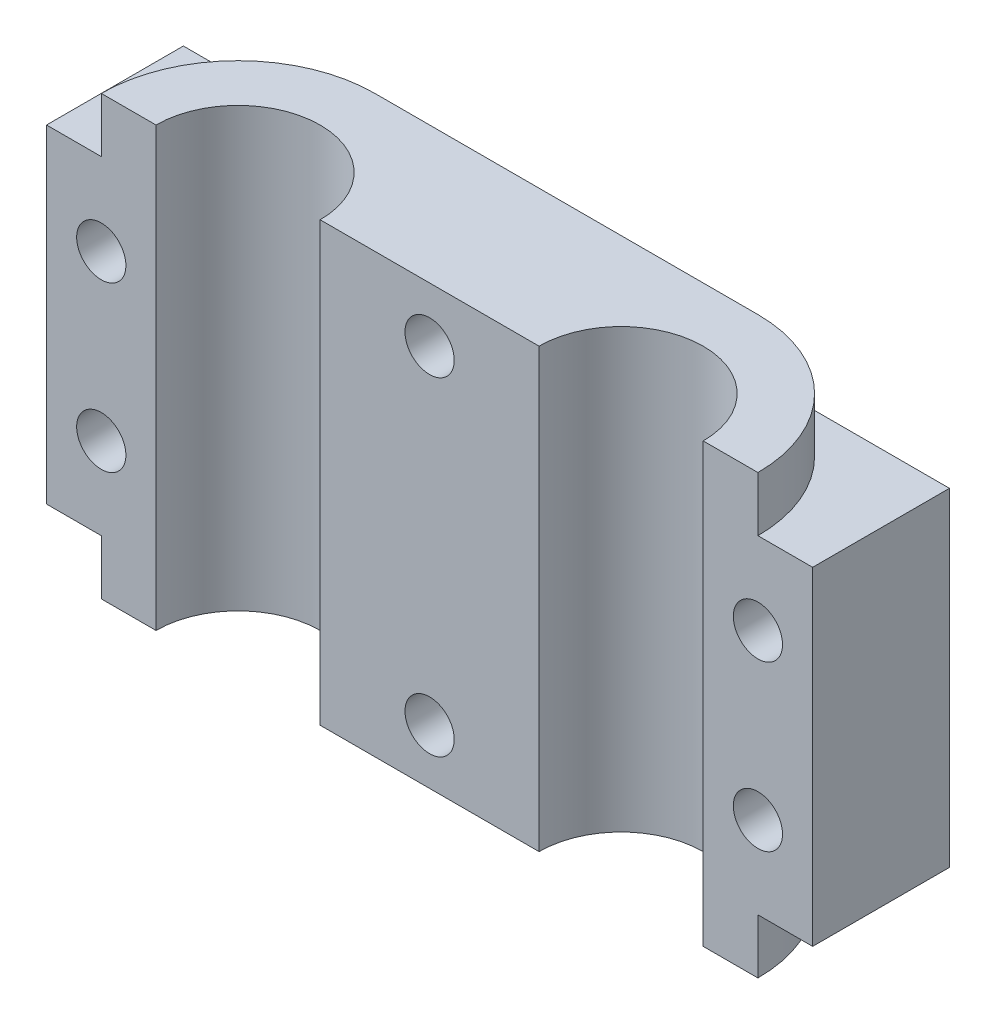
ISO-10303-21;
HEADER;
FILE_DESCRIPTION(('STEP AP214'),'2;1');
FILE_NAME('part.step','',(''),(''),'','','');
FILE_SCHEMA(('AUTOMOTIVE_DESIGN { 1 0 10303 214 1 1 1 1 }'));
ENDSEC;
DATA;
#1=APPLICATION_CONTEXT('core data for automotive mechanical design processes');
#2=APPLICATION_PROTOCOL_DEFINITION('international standard','automotive_design',2000,#1);
#3=PRODUCT_CONTEXT('',#1,'mechanical');
#4=PRODUCT('Part','Part','',(#3));
#5=PRODUCT_RELATED_PRODUCT_CATEGORY('part','',(#4));
#6=PRODUCT_DEFINITION_FORMATION('','',#4);
#7=PRODUCT_DEFINITION_CONTEXT('part definition',#1,'design');
#8=PRODUCT_DEFINITION('design','',#6,#7);
#9=PRODUCT_DEFINITION_SHAPE('','',#8);
#10=(LENGTH_UNIT() NAMED_UNIT(*) SI_UNIT(.MILLI.,.METRE.));
#11=(NAMED_UNIT(*) PLANE_ANGLE_UNIT() SI_UNIT($,.RADIAN.));
#12=(NAMED_UNIT(*) SI_UNIT($,.STERADIAN.) SOLID_ANGLE_UNIT());
#13=UNCERTAINTY_MEASURE_WITH_UNIT(LENGTH_MEASURE(1.E-05),#10,'distance_accuracy_value','');
#14=(GEOMETRIC_REPRESENTATION_CONTEXT(3) GLOBAL_UNCERTAINTY_ASSIGNED_CONTEXT((#13)) GLOBAL_UNIT_ASSIGNED_CONTEXT((#10,
#11,#12)) REPRESENTATION_CONTEXT('',''));
#15=CARTESIAN_POINT('',(0.,0.,0.));
#16=DIRECTION('',(0.,0.,1.));
#17=DIRECTION('',(1.,0.,0.));
#18=AXIS2_PLACEMENT_3D('',#15,#16,#17);
#19=CARTESIAN_POINT('',(17.5,20.,12.5));
#20=DIRECTION('',(0.,-1.,0.));
#21=DIRECTION('',(0.,0.,-1.));
#22=AXIS2_PLACEMENT_3D('',#19,#20,#21);
#23=CYLINDRICAL_SURFACE('',#22,12.5);
#24=DIRECTION('',(0.,-1.,0.));
#25=VECTOR('',#24,1.);
#26=CARTESIAN_POINT('',(17.5,20.,0.));
#27=LINE('',#26,#25);
#28=CARTESIAN_POINT('',(17.5,-15.,0.));
#29=VERTEX_POINT('',#28);
#30=CARTESIAN_POINT('',(17.5,-20.,0.));
#31=VERTEX_POINT('',#30);
#32=EDGE_CURVE('E177',#29,#31,#27,.T.);
#33=ORIENTED_EDGE('',*,*,#32,.F.);
#34=CARTESIAN_POINT('',(17.5,-15.,12.5));
#35=DIRECTION('',(0.,1.,0.));
#36=DIRECTION('',(0.,0.,1.));
#37=AXIS2_PLACEMENT_3D('',#34,#35,#36);
#38=CIRCLE('',#37,12.5);
#39=CARTESIAN_POINT('',(30.,-15.,12.5));
#40=VERTEX_POINT('',#39);
#41=EDGE_CURVE('E283',#29,#40,#38,.F.);
#42=ORIENTED_EDGE('',*,*,#41,.T.);
#43=DIRECTION('',(0.,-1.,0.));
#44=VECTOR('',#43,1.);
#45=CARTESIAN_POINT('',(30.,20.,12.5));
#46=LINE('',#45,#44);
#47=CARTESIAN_POINT('',(30.,-20.,12.5));
#48=VERTEX_POINT('',#47);
#49=EDGE_CURVE('E176',#40,#48,#46,.T.);
#50=ORIENTED_EDGE('',*,*,#49,.T.);
#51=CARTESIAN_POINT('',(17.5,-20.,12.5));
#52=DIRECTION('',(0.,1.,0.));
#53=DIRECTION('',(0.,0.,1.));
#54=AXIS2_PLACEMENT_3D('',#51,#52,#53);
#55=CIRCLE('',#54,12.5);
#56=EDGE_CURVE('E201',#31,#48,#55,.F.);
#57=ORIENTED_EDGE('',*,*,#56,.F.);
#58=EDGE_LOOP('',(#33,#42,#50,#57));
#59=FACE_BOUND('',#58,.T.);
#60=ADVANCED_FACE('F37',(#59),#23,.T.);
#61=CARTESIAN_POINT('',(-17.5,20.,12.5));
#62=DIRECTION('',(0.,-1.,0.));
#63=DIRECTION('',(0.,0.,-1.));
#64=AXIS2_PLACEMENT_3D('',#61,#62,#63);
#65=CYLINDRICAL_SURFACE('',#64,12.5);
#66=CARTESIAN_POINT('',(-17.5,-15.,12.5));
#67=DIRECTION('',(0.,1.,0.));
#68=DIRECTION('',(0.,0.,1.));
#69=AXIS2_PLACEMENT_3D('',#66,#67,#68);
#70=CIRCLE('',#69,12.5);
#71=CARTESIAN_POINT('',(-17.5,-15.,0.));
#72=VERTEX_POINT('',#71);
#73=CARTESIAN_POINT('',(-30.,-15.,12.5));
#74=VERTEX_POINT('',#73);
#75=EDGE_CURVE('E60',#72,#74,#70,.T.);
#76=ORIENTED_EDGE('',*,*,#75,.F.);
#77=DIRECTION('',(0.,-1.,0.));
#78=VECTOR('',#77,1.);
#79=CARTESIAN_POINT('',(-17.5,20.,0.));
#80=LINE('',#79,#78);
#81=CARTESIAN_POINT('',(-17.5,-20.,0.));
#82=VERTEX_POINT('',#81);
#83=EDGE_CURVE('E227',#72,#82,#80,.T.);
#84=ORIENTED_EDGE('',*,*,#83,.T.);
#85=CARTESIAN_POINT('',(-17.5,-20.,12.5));
#86=DIRECTION('',(0.,1.,0.));
#87=DIRECTION('',(0.,0.,1.));
#88=AXIS2_PLACEMENT_3D('',#85,#86,#87);
#89=CIRCLE('',#88,12.5);
#90=CARTESIAN_POINT('',(-30.,-20.,12.5));
#91=VERTEX_POINT('',#90);
#92=EDGE_CURVE('E210',#82,#91,#89,.T.);
#93=ORIENTED_EDGE('',*,*,#92,.T.);
#94=DIRECTION('',(0.,-1.,0.));
#95=VECTOR('',#94,1.);
#96=CARTESIAN_POINT('',(-30.,20.,12.5));
#97=LINE('',#96,#95);
#98=EDGE_CURVE('E224',#74,#91,#97,.T.);
#99=ORIENTED_EDGE('',*,*,#98,.F.);
#100=EDGE_LOOP('',(#76,#84,#93,#99));
#101=FACE_BOUND('',#100,.T.);
#102=ADVANCED_FACE('F240',(#101),#65,.T.);
#103=CARTESIAN_POINT('',(0.,20.,12.5));
#104=DIRECTION('',(0.,0.,-1.));
#105=DIRECTION('',(-1.,0.,0.));
#106=AXIS2_PLACEMENT_3D('',#103,#104,#105);
#107=PLANE('',#106);
#108=CARTESIAN_POINT('',(0.,15.,12.5));
#109=DIRECTION('',(0.,0.,1.));
#110=DIRECTION('',(1.,0.,0.));
#111=AXIS2_PLACEMENT_3D('',#108,#109,#110);
#112=CIRCLE('',#111,2.25);
#113=CARTESIAN_POINT('',(2.24999999999999,15.,12.5));
#114=VERTEX_POINT('',#113);
#115=EDGE_CURVE('E366',#114,#114,#112,.T.);
#116=ORIENTED_EDGE('',*,*,#115,.F.);
#117=EDGE_LOOP('',(#116));
#118=FACE_BOUND('',#117,.T.);
#119=CARTESIAN_POINT('',(0.,-15.,12.5));
#120=DIRECTION('',(0.,0.,1.));
#121=DIRECTION('',(1.,0.,0.));
#122=AXIS2_PLACEMENT_3D('',#119,#120,#121);
#123=CIRCLE('',#122,2.25);
#124=CARTESIAN_POINT('',(2.25,-15.,12.5));
#125=VERTEX_POINT('',#124);
#126=EDGE_CURVE('E363',#125,#125,#123,.T.);
#127=ORIENTED_EDGE('',*,*,#126,.F.);
#128=EDGE_LOOP('',(#127));
#129=FACE_BOUND('',#128,.T.);
#130=DIRECTION('',(1.,0.,0.));
#131=VECTOR('',#130,1.);
#132=CARTESIAN_POINT('',(0.,-20.,12.5));
#133=LINE('',#132,#131);
#134=CARTESIAN_POINT('',(-10.,-20.,12.5));
#135=VERTEX_POINT('',#134);
#136=CARTESIAN_POINT('',(10.,-20.,12.5));
#137=VERTEX_POINT('',#136);
#138=EDGE_CURVE('E205',#135,#137,#133,.T.);
#139=ORIENTED_EDGE('',*,*,#138,.T.);
#140=DIRECTION('',(0.,-1.,0.));
#141=VECTOR('',#140,1.);
#142=CARTESIAN_POINT('',(10.,20.,12.5));
#143=LINE('',#142,#141);
#144=CARTESIAN_POINT('',(10.,20.,12.5));
#145=VERTEX_POINT('',#144);
#146=EDGE_CURVE('E11',#145,#137,#143,.T.);
#147=ORIENTED_EDGE('',*,*,#146,.F.);
#148=DIRECTION('',(1.,0.,0.));
#149=VECTOR('',#148,1.);
#150=CARTESIAN_POINT('',(0.,20.,12.5));
#151=LINE('',#150,#149);
#152=CARTESIAN_POINT('',(-10.,20.,12.5));
#153=VERTEX_POINT('',#152);
#154=EDGE_CURVE('E219',#153,#145,#151,.T.);
#155=ORIENTED_EDGE('',*,*,#154,.F.);
#156=DIRECTION('',(0.,-1.,0.));
#157=VECTOR('',#156,1.);
#158=CARTESIAN_POINT('',(-10.,20.,12.5));
#159=LINE('',#158,#157);
#160=EDGE_CURVE('E220',#153,#135,#159,.T.);
#161=ORIENTED_EDGE('',*,*,#160,.T.);
#162=EDGE_LOOP('',(#139,#147,#155,#161));
#163=FACE_BOUND('',#162,.T.);
#164=ADVANCED_FACE('F39',(#118,#129,#163),#107,.F.);
#165=CARTESIAN_POINT('',(17.5,20.,12.5));
#166=DIRECTION('',(0.,-1.,0.));
#167=DIRECTION('',(0.,0.,-1.));
#168=AXIS2_PLACEMENT_3D('',#165,#166,#167);
#169=CYLINDRICAL_SURFACE('',#168,7.5);
#170=CARTESIAN_POINT('',(17.5,-20.,12.5));
#171=DIRECTION('',(0.,1.,0.));
#172=DIRECTION('',(0.,0.,1.));
#173=AXIS2_PLACEMENT_3D('',#170,#171,#172);
#174=CIRCLE('',#173,7.5);
#175=CARTESIAN_POINT('',(25.,-20.,12.5));
#176=VERTEX_POINT('',#175);
#177=EDGE_CURVE('E198',#137,#176,#174,.F.);
#178=ORIENTED_EDGE('',*,*,#177,.T.);
#179=DIRECTION('',(0.,-1.,0.));
#180=VECTOR('',#179,1.);
#181=CARTESIAN_POINT('',(25.,20.,12.5));
#182=LINE('',#181,#180);
#183=CARTESIAN_POINT('',(25.,20.,12.5));
#184=VERTEX_POINT('',#183);
#185=EDGE_CURVE('E45',#184,#176,#182,.T.);
#186=ORIENTED_EDGE('',*,*,#185,.F.);
#187=CARTESIAN_POINT('',(17.5,20.,12.5));
#188=DIRECTION('',(0.,1.,0.));
#189=DIRECTION('',(0.,0.,1.));
#190=AXIS2_PLACEMENT_3D('',#187,#188,#189);
#191=CIRCLE('',#190,7.5);
#192=EDGE_CURVE('E270',#145,#184,#191,.F.);
#193=ORIENTED_EDGE('',*,*,#192,.F.);
#194=ORIENTED_EDGE('',*,*,#146,.T.);
#195=EDGE_LOOP('',(#178,#186,#193,#194));
#196=FACE_BOUND('',#195,.T.);
#197=ADVANCED_FACE('F340',(#196),#169,.F.);
#198=CARTESIAN_POINT('',(0.,20.,12.5));
#199=DIRECTION('',(0.,0.,-1.));
#200=DIRECTION('',(-1.,0.,0.));
#201=AXIS2_PLACEMENT_3D('',#198,#199,#200);
#202=PLANE('',#201);
#203=CARTESIAN_POINT('',(30.,7.50000000000002,12.5));
#204=DIRECTION('',(0.,0.,1.));
#205=DIRECTION('',(-1.,0.,0.));
#206=AXIS2_PLACEMENT_3D('',#203,#204,#205);
#207=CIRCLE('',#206,2.25);
#208=CARTESIAN_POINT('',(27.75,7.50000000000002,12.5));
#209=VERTEX_POINT('',#208);
#210=EDGE_CURVE('E348',#209,#209,#207,.T.);
#211=ORIENTED_EDGE('',*,*,#210,.F.);
#212=EDGE_LOOP('',(#211));
#213=FACE_BOUND('',#212,.T.);
#214=CARTESIAN_POINT('',(30.,-7.49999999999998,12.5));
#215=DIRECTION('',(0.,0.,1.));
#216=DIRECTION('',(-1.,0.,0.));
#217=AXIS2_PLACEMENT_3D('',#214,#215,#216);
#218=CIRCLE('',#217,2.25);
#219=CARTESIAN_POINT('',(27.75,-7.49999999999998,12.5));
#220=VERTEX_POINT('',#219);
#221=EDGE_CURVE('E351',#220,#220,#218,.T.);
#222=ORIENTED_EDGE('',*,*,#221,.F.);
#223=EDGE_LOOP('',(#222));
#224=FACE_BOUND('',#223,.T.);
#225=DIRECTION('',(1.,0.,0.));
#226=VECTOR('',#225,1.);
#227=CARTESIAN_POINT('',(0.,-20.,12.5));
#228=LINE('',#227,#226);
#229=EDGE_CURVE('E191',#176,#48,#228,.T.);
#230=ORIENTED_EDGE('',*,*,#229,.T.);
#231=ORIENTED_EDGE('',*,*,#49,.F.);
#232=DIRECTION('',(1.,0.,0.));
#233=VECTOR('',#232,1.);
#234=CARTESIAN_POINT('',(0.,-15.,12.5));
#235=LINE('',#234,#233);
#236=CARTESIAN_POINT('',(35.,-15.,12.5));
#237=VERTEX_POINT('',#236);
#238=EDGE_CURVE('E287',#40,#237,#235,.T.);
#239=ORIENTED_EDGE('',*,*,#238,.T.);
#240=DIRECTION('',(0.,-1.,0.));
#241=VECTOR('',#240,1.);
#242=CARTESIAN_POINT('',(35.,15.,12.5));
#243=LINE('',#242,#241);
#244=CARTESIAN_POINT('',(35.,15.,12.5));
#245=VERTEX_POINT('',#244);
#246=EDGE_CURVE('E277',#245,#237,#243,.T.);
#247=ORIENTED_EDGE('',*,*,#246,.F.);
#248=DIRECTION('',(1.,0.,0.));
#249=VECTOR('',#248,1.);
#250=CARTESIAN_POINT('',(0.,15.,12.5));
#251=LINE('',#250,#249);
#252=CARTESIAN_POINT('',(30.,15.,12.5));
#253=VERTEX_POINT('',#252);
#254=EDGE_CURVE('E169',#253,#245,#251,.T.);
#255=ORIENTED_EDGE('',*,*,#254,.F.);
#256=CARTESIAN_POINT('',(30.,20.,12.5));
#257=VERTEX_POINT('',#256);
#258=EDGE_CURVE('E168',#257,#253,#46,.T.);
#259=ORIENTED_EDGE('',*,*,#258,.F.);
#260=DIRECTION('',(1.,0.,0.));
#261=VECTOR('',#260,1.);
#262=CARTESIAN_POINT('',(0.,20.,12.5));
#263=LINE('',#262,#261);
#264=EDGE_CURVE('E193',#184,#257,#263,.T.);
#265=ORIENTED_EDGE('',*,*,#264,.F.);
#266=ORIENTED_EDGE('',*,*,#185,.T.);
#267=EDGE_LOOP('',(#230,#231,#239,#247,#255,#259,#265,#266));
#268=FACE_BOUND('',#267,.T.);
#269=ADVANCED_FACE('F189',(#213,#224,#268),#202,.F.);
#270=CARTESIAN_POINT('',(17.5,15.,12.5));
#271=DIRECTION('',(0.,1.,0.));
#272=DIRECTION('',(0.,0.,1.));
#273=AXIS2_PLACEMENT_3D('',#270,#271,#272);
#274=CIRCLE('',#273,12.5);
#275=CARTESIAN_POINT('',(17.5,15.,0.));
#276=VERTEX_POINT('',#275);
#277=EDGE_CURVE('E153',#276,#253,#274,.F.);
#278=ORIENTED_EDGE('',*,*,#277,.F.);
#279=CARTESIAN_POINT('',(17.5,20.,0.));
#280=VERTEX_POINT('',#279);
#281=EDGE_CURVE('E165',#280,#276,#27,.T.);
#282=ORIENTED_EDGE('',*,*,#281,.F.);
#283=CARTESIAN_POINT('',(17.5,20.,12.5));
#284=DIRECTION('',(0.,1.,0.));
#285=DIRECTION('',(0.,0.,1.));
#286=AXIS2_PLACEMENT_3D('',#283,#284,#285);
#287=CIRCLE('',#286,12.5);
#288=EDGE_CURVE('E273',#280,#257,#287,.F.);
#289=ORIENTED_EDGE('',*,*,#288,.T.);
#290=ORIENTED_EDGE('',*,*,#258,.T.);
#291=EDGE_LOOP('',(#278,#282,#289,#290));
#292=FACE_BOUND('',#291,.T.);
#293=ADVANCED_FACE('F163',(#292),#23,.T.);
#294=CARTESIAN_POINT('',(0.,20.,0.));
#295=DIRECTION('',(0.,0.,-1.));
#296=DIRECTION('',(-1.,0.,0.));
#297=AXIS2_PLACEMENT_3D('',#294,#295,#296);
#298=PLANE('',#297);
#299=CARTESIAN_POINT('',(0.,15.,0.));
#300=DIRECTION('',(0.,0.,1.));
#301=DIRECTION('',(1.,0.,0.));
#302=AXIS2_PLACEMENT_3D('',#299,#300,#301);
#303=CIRCLE('',#302,2.25);
#304=CARTESIAN_POINT('',(2.24999999999999,15.,0.));
#305=VERTEX_POINT('',#304);
#306=EDGE_CURVE('E284',#305,#305,#303,.T.);
#307=ORIENTED_EDGE('',*,*,#306,.T.);
#308=EDGE_LOOP('',(#307));
#309=FACE_BOUND('',#308,.T.);
#310=CARTESIAN_POINT('',(30.,7.50000000000002,0.));
#311=DIRECTION('',(0.,0.,1.));
#312=DIRECTION('',(-1.,0.,0.));
#313=AXIS2_PLACEMENT_3D('',#310,#311,#312);
#314=CIRCLE('',#313,2.25);
#315=CARTESIAN_POINT('',(27.75,7.50000000000002,0.));
#316=VERTEX_POINT('',#315);
#317=EDGE_CURVE('E381',#316,#316,#314,.T.);
#318=ORIENTED_EDGE('',*,*,#317,.T.);
#319=EDGE_LOOP('',(#318));
#320=FACE_BOUND('',#319,.T.);
#321=CARTESIAN_POINT('',(0.,-15.,0.));
#322=DIRECTION('',(0.,0.,1.));
#323=DIRECTION('',(1.,0.,0.));
#324=AXIS2_PLACEMENT_3D('',#321,#322,#323);
#325=CIRCLE('',#324,2.25);
#326=CARTESIAN_POINT('',(2.25,-15.,0.));
#327=VERTEX_POINT('',#326);
#328=EDGE_CURVE('E367',#327,#327,#325,.T.);
#329=ORIENTED_EDGE('',*,*,#328,.T.);
#330=EDGE_LOOP('',(#329));
#331=FACE_BOUND('',#330,.T.);
#332=CARTESIAN_POINT('',(-30.,7.5,0.));
#333=DIRECTION('',(0.,0.,1.));
#334=DIRECTION('',(1.,0.,0.));
#335=AXIS2_PLACEMENT_3D('',#332,#333,#334);
#336=CIRCLE('',#335,2.25);
#337=CARTESIAN_POINT('',(-27.75,7.5,0.));
#338=VERTEX_POINT('',#337);
#339=EDGE_CURVE('E373',#338,#338,#336,.T.);
#340=ORIENTED_EDGE('',*,*,#339,.T.);
#341=EDGE_LOOP('',(#340));
#342=FACE_BOUND('',#341,.T.);
#343=CARTESIAN_POINT('',(-30.,-7.5,0.));
#344=DIRECTION('',(0.,0.,1.));
#345=DIRECTION('',(1.,0.,0.));
#346=AXIS2_PLACEMENT_3D('',#343,#344,#345);
#347=CIRCLE('',#346,2.25);
#348=CARTESIAN_POINT('',(-27.75,-7.5,0.));
#349=VERTEX_POINT('',#348);
#350=EDGE_CURVE('E353',#349,#349,#347,.T.);
#351=ORIENTED_EDGE('',*,*,#350,.T.);
#352=EDGE_LOOP('',(#351));
#353=FACE_BOUND('',#352,.T.);
#354=CARTESIAN_POINT('',(30.,-7.49999999999998,0.));
#355=DIRECTION('',(0.,0.,1.));
#356=DIRECTION('',(-1.,0.,0.));
#357=AXIS2_PLACEMENT_3D('',#354,#355,#356);
#358=CIRCLE('',#357,2.25);
#359=CARTESIAN_POINT('',(27.75,-7.49999999999998,0.));
#360=VERTEX_POINT('',#359);
#361=EDGE_CURVE('E354',#360,#360,#358,.T.);
#362=ORIENTED_EDGE('',*,*,#361,.T.);
#363=EDGE_LOOP('',(#362));
#364=FACE_BOUND('',#363,.T.);
#365=DIRECTION('',(1.,0.,0.));
#366=VECTOR('',#365,1.);
#367=CARTESIAN_POINT('',(0.,-20.,0.));
#368=LINE('',#367,#366);
#369=EDGE_CURVE('E203',#82,#31,#368,.T.);
#370=ORIENTED_EDGE('',*,*,#369,.F.);
#371=ORIENTED_EDGE('',*,*,#83,.F.);
#372=DIRECTION('',(1.,0.,0.));
#373=VECTOR('',#372,1.);
#374=CARTESIAN_POINT('',(0.,-15.,0.));
#375=LINE('',#374,#373);
#376=CARTESIAN_POINT('',(-35.,-15.,0.));
#377=VERTEX_POINT('',#376);
#378=EDGE_CURVE('E303',#377,#72,#375,.T.);
#379=ORIENTED_EDGE('',*,*,#378,.F.);
#380=DIRECTION('',(0.,-1.,0.));
#381=VECTOR('',#380,1.);
#382=CARTESIAN_POINT('',(-35.,15.,0.));
#383=LINE('',#382,#381);
#384=CARTESIAN_POINT('',(-35.,15.,0.));
#385=VERTEX_POINT('',#384);
#386=EDGE_CURVE('E256',#385,#377,#383,.T.);
#387=ORIENTED_EDGE('',*,*,#386,.F.);
#388=DIRECTION('',(1.,0.,0.));
#389=VECTOR('',#388,1.);
#390=CARTESIAN_POINT('',(0.,15.,0.));
#391=LINE('',#390,#389);
#392=CARTESIAN_POINT('',(-17.5,15.,0.));
#393=VERTEX_POINT('',#392);
#394=EDGE_CURVE('E296',#385,#393,#391,.T.);
#395=ORIENTED_EDGE('',*,*,#394,.T.);
#396=CARTESIAN_POINT('',(-17.5,20.,0.));
#397=VERTEX_POINT('',#396);
#398=EDGE_CURVE('E180',#397,#393,#80,.T.);
#399=ORIENTED_EDGE('',*,*,#398,.F.);
#400=DIRECTION('',(1.,0.,0.));
#401=VECTOR('',#400,1.);
#402=CARTESIAN_POINT('',(0.,20.,0.));
#403=LINE('',#402,#401);
#404=EDGE_CURVE('E175',#397,#280,#403,.T.);
#405=ORIENTED_EDGE('',*,*,#404,.T.);
#406=ORIENTED_EDGE('',*,*,#281,.T.);
#407=DIRECTION('',(1.,0.,0.));
#408=VECTOR('',#407,1.);
#409=CARTESIAN_POINT('',(0.,15.,0.));
#410=LINE('',#409,#408);
#411=CARTESIAN_POINT('',(35.,15.,0.));
#412=VERTEX_POINT('',#411);
#413=EDGE_CURVE('E150',#276,#412,#410,.T.);
#414=ORIENTED_EDGE('',*,*,#413,.T.);
#415=DIRECTION('',(0.,-1.,0.));
#416=VECTOR('',#415,1.);
#417=CARTESIAN_POINT('',(35.,15.,0.));
#418=LINE('',#417,#416);
#419=CARTESIAN_POINT('',(35.,-15.,0.));
#420=VERTEX_POINT('',#419);
#421=EDGE_CURVE('E279',#412,#420,#418,.T.);
#422=ORIENTED_EDGE('',*,*,#421,.T.);
#423=DIRECTION('',(1.,0.,0.));
#424=VECTOR('',#423,1.);
#425=CARTESIAN_POINT('',(0.,-15.,0.));
#426=LINE('',#425,#424);
#427=EDGE_CURVE('E52',#29,#420,#426,.T.);
#428=ORIENTED_EDGE('',*,*,#427,.F.);
#429=ORIENTED_EDGE('',*,*,#32,.T.);
#430=EDGE_LOOP('',(#370,#371,#379,#387,#395,#399,#405,#406,#414,#422,#428,#429));
#431=FACE_BOUND('',#430,.T.);
#432=ADVANCED_FACE('F173',(#309,#320,#331,#342,#353,#364,#431),#298,.T.);
#433=ORIENTED_EDGE('',*,*,#398,.T.);
#434=CARTESIAN_POINT('',(-17.5,15.,12.5));
#435=DIRECTION('',(0.,1.,0.));
#436=DIRECTION('',(0.,0.,1.));
#437=AXIS2_PLACEMENT_3D('',#434,#435,#436);
#438=CIRCLE('',#437,12.5);
#439=CARTESIAN_POINT('',(-30.,15.,12.5));
#440=VERTEX_POINT('',#439);
#441=EDGE_CURVE('E293',#393,#440,#438,.T.);
#442=ORIENTED_EDGE('',*,*,#441,.T.);
#443=CARTESIAN_POINT('',(-30.,20.,12.5));
#444=VERTEX_POINT('',#443);
#445=EDGE_CURVE('E225',#444,#440,#97,.T.);
#446=ORIENTED_EDGE('',*,*,#445,.F.);
#447=CARTESIAN_POINT('',(-17.5,20.,12.5));
#448=DIRECTION('',(0.,1.,0.));
#449=DIRECTION('',(0.,0.,1.));
#450=AXIS2_PLACEMENT_3D('',#447,#448,#449);
#451=CIRCLE('',#450,12.5);
#452=EDGE_CURVE('E251',#397,#444,#451,.T.);
#453=ORIENTED_EDGE('',*,*,#452,.F.);
#454=EDGE_LOOP('',(#433,#442,#446,#453));
#455=FACE_BOUND('',#454,.T.);
#456=ADVANCED_FACE('F330',(#455),#65,.T.);
#457=CARTESIAN_POINT('',(0.,20.,12.5));
#458=DIRECTION('',(0.,0.,-1.));
#459=DIRECTION('',(-1.,0.,0.));
#460=AXIS2_PLACEMENT_3D('',#457,#458,#459);
#461=PLANE('',#460);
#462=CARTESIAN_POINT('',(-30.,7.5,12.5));
#463=DIRECTION('',(0.,0.,1.));
#464=DIRECTION('',(1.,0.,0.));
#465=AXIS2_PLACEMENT_3D('',#462,#463,#464);
#466=CIRCLE('',#465,2.25);
#467=CARTESIAN_POINT('',(-27.75,7.5,12.5));
#468=VERTEX_POINT('',#467);
#469=EDGE_CURVE('E370',#468,#468,#466,.T.);
#470=ORIENTED_EDGE('',*,*,#469,.F.);
#471=EDGE_LOOP('',(#470));
#472=FACE_BOUND('',#471,.T.);
#473=CARTESIAN_POINT('',(-30.,-7.5,12.5));
#474=DIRECTION('',(0.,0.,1.));
#475=DIRECTION('',(1.,0.,0.));
#476=AXIS2_PLACEMENT_3D('',#473,#474,#475);
#477=CIRCLE('',#476,2.25);
#478=CARTESIAN_POINT('',(-27.75,-7.5,12.5));
#479=VERTEX_POINT('',#478);
#480=EDGE_CURVE('E357',#479,#479,#477,.T.);
#481=ORIENTED_EDGE('',*,*,#480,.F.);
#482=EDGE_LOOP('',(#481));
#483=FACE_BOUND('',#482,.T.);
#484=DIRECTION('',(1.,0.,0.));
#485=VECTOR('',#484,1.);
#486=CARTESIAN_POINT('',(0.,-20.,12.5));
#487=LINE('',#486,#485);
#488=CARTESIAN_POINT('',(-25.,-20.,12.5));
#489=VERTEX_POINT('',#488);
#490=EDGE_CURVE('E213',#91,#489,#487,.T.);
#491=ORIENTED_EDGE('',*,*,#490,.T.);
#492=DIRECTION('',(0.,-1.,0.));
#493=VECTOR('',#492,1.);
#494=CARTESIAN_POINT('',(-25.,20.,12.5));
#495=LINE('',#494,#493);
#496=CARTESIAN_POINT('',(-25.,20.,12.5));
#497=VERTEX_POINT('',#496);
#498=EDGE_CURVE('E222',#497,#489,#495,.T.);
#499=ORIENTED_EDGE('',*,*,#498,.F.);
#500=DIRECTION('',(1.,0.,0.));
#501=VECTOR('',#500,1.);
#502=CARTESIAN_POINT('',(0.,20.,12.5));
#503=LINE('',#502,#501);
#504=EDGE_CURVE('E249',#444,#497,#503,.T.);
#505=ORIENTED_EDGE('',*,*,#504,.F.);
#506=ORIENTED_EDGE('',*,*,#445,.T.);
#507=DIRECTION('',(1.,0.,0.));
#508=VECTOR('',#507,1.);
#509=CARTESIAN_POINT('',(0.,15.,12.5));
#510=LINE('',#509,#508);
#511=CARTESIAN_POINT('',(-35.,15.,12.5));
#512=VERTEX_POINT('',#511);
#513=EDGE_CURVE('E264',#512,#440,#510,.T.);
#514=ORIENTED_EDGE('',*,*,#513,.F.);
#515=DIRECTION('',(0.,-1.,0.));
#516=VECTOR('',#515,1.);
#517=CARTESIAN_POINT('',(-35.,15.,12.5));
#518=LINE('',#517,#516);
#519=CARTESIAN_POINT('',(-35.,-15.,12.5));
#520=VERTEX_POINT('',#519);
#521=EDGE_CURVE('E259',#512,#520,#518,.T.);
#522=ORIENTED_EDGE('',*,*,#521,.T.);
#523=DIRECTION('',(1.,0.,0.));
#524=VECTOR('',#523,1.);
#525=CARTESIAN_POINT('',(0.,-15.,12.5));
#526=LINE('',#525,#524);
#527=EDGE_CURVE('E237',#520,#74,#526,.T.);
#528=ORIENTED_EDGE('',*,*,#527,.T.);
#529=ORIENTED_EDGE('',*,*,#98,.T.);
#530=EDGE_LOOP('',(#491,#499,#505,#506,#514,#522,#528,#529));
#531=FACE_BOUND('',#530,.T.);
#532=ADVANCED_FACE('F233',(#472,#483,#531),#461,.F.);
#533=CARTESIAN_POINT('',(-17.5,20.,12.5));
#534=DIRECTION('',(0.,-1.,0.));
#535=DIRECTION('',(0.,0.,-1.));
#536=AXIS2_PLACEMENT_3D('',#533,#534,#535);
#537=CYLINDRICAL_SURFACE('',#536,7.5);
#538=CARTESIAN_POINT('',(-17.5,-20.,12.5));
#539=DIRECTION('',(0.,1.,0.));
#540=DIRECTION('',(0.,0.,1.));
#541=AXIS2_PLACEMENT_3D('',#538,#539,#540);
#542=CIRCLE('',#541,7.5);
#543=EDGE_CURVE('E216',#135,#489,#542,.T.);
#544=ORIENTED_EDGE('',*,*,#543,.F.);
#545=ORIENTED_EDGE('',*,*,#160,.F.);
#546=CARTESIAN_POINT('',(-17.5,20.,12.5));
#547=DIRECTION('',(0.,1.,0.));
#548=DIRECTION('',(0.,0.,1.));
#549=AXIS2_PLACEMENT_3D('',#546,#547,#548);
#550=CIRCLE('',#549,7.5);
#551=EDGE_CURVE('E223',#153,#497,#550,.T.);
#552=ORIENTED_EDGE('',*,*,#551,.T.);
#553=ORIENTED_EDGE('',*,*,#498,.T.);
#554=EDGE_LOOP('',(#544,#545,#552,#553));
#555=FACE_BOUND('',#554,.T.);
#556=ADVANCED_FACE('F245',(#555),#537,.F.);
#557=CARTESIAN_POINT('',(0.,20.,0.));
#558=DIRECTION('',(0.,1.,0.));
#559=DIRECTION('',(0.,0.,1.));
#560=AXIS2_PLACEMENT_3D('',#557,#558,#559);
#561=PLANE('',#560);
#562=ORIENTED_EDGE('',*,*,#154,.T.);
#563=ORIENTED_EDGE('',*,*,#192,.T.);
#564=ORIENTED_EDGE('',*,*,#264,.T.);
#565=ORIENTED_EDGE('',*,*,#288,.F.);
#566=ORIENTED_EDGE('',*,*,#404,.F.);
#567=ORIENTED_EDGE('',*,*,#452,.T.);
#568=ORIENTED_EDGE('',*,*,#504,.T.);
#569=ORIENTED_EDGE('',*,*,#551,.F.);
#570=EDGE_LOOP('',(#562,#563,#564,#565,#566,#567,#568,#569));
#571=FACE_BOUND('',#570,.T.);
#572=ADVANCED_FACE('F274',(#571),#561,.T.);
#573=CARTESIAN_POINT('',(0.,-20.,0.));
#574=DIRECTION('',(0.,1.,0.));
#575=DIRECTION('',(0.,0.,1.));
#576=AXIS2_PLACEMENT_3D('',#573,#574,#575);
#577=PLANE('',#576);
#578=ORIENTED_EDGE('',*,*,#138,.F.);
#579=ORIENTED_EDGE('',*,*,#543,.T.);
#580=ORIENTED_EDGE('',*,*,#490,.F.);
#581=ORIENTED_EDGE('',*,*,#92,.F.);
#582=ORIENTED_EDGE('',*,*,#369,.T.);
#583=ORIENTED_EDGE('',*,*,#56,.T.);
#584=ORIENTED_EDGE('',*,*,#229,.F.);
#585=ORIENTED_EDGE('',*,*,#177,.F.);
#586=EDGE_LOOP('',(#578,#579,#580,#581,#582,#583,#584,#585));
#587=FACE_BOUND('',#586,.T.);
#588=ADVANCED_FACE('F197',(#587),#577,.F.);
#589=CARTESIAN_POINT('',(-35.,15.,0.));
#590=DIRECTION('',(1.,0.,0.));
#591=DIRECTION('',(0.,0.,-1.));
#592=AXIS2_PLACEMENT_3D('',#589,#590,#591);
#593=PLANE('',#592);
#594=DIRECTION('',(0.,0.,1.));
#595=VECTOR('',#594,1.);
#596=CARTESIAN_POINT('',(-35.,-15.,0.));
#597=LINE('',#596,#595);
#598=EDGE_CURVE('E305',#377,#520,#597,.T.);
#599=ORIENTED_EDGE('',*,*,#598,.T.);
#600=ORIENTED_EDGE('',*,*,#521,.F.);
#601=DIRECTION('',(0.,0.,1.));
#602=VECTOR('',#601,1.);
#603=CARTESIAN_POINT('',(-35.,15.,0.));
#604=LINE('',#603,#602);
#605=EDGE_CURVE('E299',#385,#512,#604,.T.);
#606=ORIENTED_EDGE('',*,*,#605,.F.);
#607=ORIENTED_EDGE('',*,*,#386,.T.);
#608=EDGE_LOOP('',(#599,#600,#606,#607));
#609=FACE_BOUND('',#608,.T.);
#610=ADVANCED_FACE('F307',(#609),#593,.F.);
#611=CARTESIAN_POINT('',(0.,15.,0.));
#612=DIRECTION('',(0.,1.,0.));
#613=DIRECTION('',(0.,0.,1.));
#614=AXIS2_PLACEMENT_3D('',#611,#612,#613);
#615=PLANE('',#614);
#616=ORIENTED_EDGE('',*,*,#441,.F.);
#617=ORIENTED_EDGE('',*,*,#394,.F.);
#618=ORIENTED_EDGE('',*,*,#605,.T.);
#619=ORIENTED_EDGE('',*,*,#513,.T.);
#620=EDGE_LOOP('',(#616,#617,#618,#619));
#621=FACE_BOUND('',#620,.T.);
#622=ADVANCED_FACE('F312',(#621),#615,.T.);
#623=CARTESIAN_POINT('',(0.,-15.,0.));
#624=DIRECTION('',(0.,1.,0.));
#625=DIRECTION('',(0.,0.,1.));
#626=AXIS2_PLACEMENT_3D('',#623,#624,#625);
#627=PLANE('',#626);
#628=ORIENTED_EDGE('',*,*,#75,.T.);
#629=ORIENTED_EDGE('',*,*,#527,.F.);
#630=ORIENTED_EDGE('',*,*,#598,.F.);
#631=ORIENTED_EDGE('',*,*,#378,.T.);
#632=EDGE_LOOP('',(#628,#629,#630,#631));
#633=FACE_BOUND('',#632,.T.);
#634=ADVANCED_FACE('F309',(#633),#627,.F.);
#635=CARTESIAN_POINT('',(35.,15.,0.));
#636=DIRECTION('',(-1.,0.,0.));
#637=DIRECTION('',(0.,0.,1.));
#638=AXIS2_PLACEMENT_3D('',#635,#636,#637);
#639=PLANE('',#638);
#640=DIRECTION('',(0.,0.,-1.));
#641=VECTOR('',#640,1.);
#642=CARTESIAN_POINT('',(35.,-15.,0.));
#643=LINE('',#642,#641);
#644=EDGE_CURVE('E159',#237,#420,#643,.T.);
#645=ORIENTED_EDGE('',*,*,#644,.T.);
#646=ORIENTED_EDGE('',*,*,#421,.F.);
#647=DIRECTION('',(0.,0.,-1.));
#648=VECTOR('',#647,1.);
#649=CARTESIAN_POINT('',(35.,15.,0.));
#650=LINE('',#649,#648);
#651=EDGE_CURVE('E156',#245,#412,#650,.T.);
#652=ORIENTED_EDGE('',*,*,#651,.F.);
#653=ORIENTED_EDGE('',*,*,#246,.T.);
#654=EDGE_LOOP('',(#645,#646,#652,#653));
#655=FACE_BOUND('',#654,.T.);
#656=ADVANCED_FACE('F311',(#655),#639,.F.);
#657=CARTESIAN_POINT('',(0.,15.,0.));
#658=DIRECTION('',(0.,1.,0.));
#659=DIRECTION('',(0.,0.,1.));
#660=AXIS2_PLACEMENT_3D('',#657,#658,#659);
#661=PLANE('',#660);
#662=ORIENTED_EDGE('',*,*,#413,.F.);
#663=ORIENTED_EDGE('',*,*,#277,.T.);
#664=ORIENTED_EDGE('',*,*,#254,.T.);
#665=ORIENTED_EDGE('',*,*,#651,.T.);
#666=EDGE_LOOP('',(#662,#663,#664,#665));
#667=FACE_BOUND('',#666,.T.);
#668=ADVANCED_FACE('F152',(#667),#661,.T.);
#669=CARTESIAN_POINT('',(0.,-15.,0.));
#670=DIRECTION('',(0.,1.,0.));
#671=DIRECTION('',(0.,0.,1.));
#672=AXIS2_PLACEMENT_3D('',#669,#670,#671);
#673=PLANE('',#672);
#674=ORIENTED_EDGE('',*,*,#427,.T.);
#675=ORIENTED_EDGE('',*,*,#644,.F.);
#676=ORIENTED_EDGE('',*,*,#238,.F.);
#677=ORIENTED_EDGE('',*,*,#41,.F.);
#678=EDGE_LOOP('',(#674,#675,#676,#677));
#679=FACE_BOUND('',#678,.T.);
#680=ADVANCED_FACE('F425',(#679),#673,.F.);
#681=CARTESIAN_POINT('',(-30.,-7.5,0.));
#682=DIRECTION('',(0.,0.,1.));
#683=DIRECTION('',(1.,0.,0.));
#684=AXIS2_PLACEMENT_3D('',#681,#682,#683);
#685=CYLINDRICAL_SURFACE('',#684,2.25);
#686=ORIENTED_EDGE('',*,*,#350,.F.);
#687=EDGE_LOOP('',(#686));
#688=FACE_BOUND('',#687,.T.);
#689=ORIENTED_EDGE('',*,*,#480,.T.);
#690=EDGE_LOOP('',(#689));
#691=FACE_BOUND('',#690,.T.);
#692=ADVANCED_FACE('F421',(#688,#691),#685,.F.);
#693=CARTESIAN_POINT('',(-30.,7.5,0.));
#694=DIRECTION('',(0.,0.,1.));
#695=DIRECTION('',(1.,0.,0.));
#696=AXIS2_PLACEMENT_3D('',#693,#694,#695);
#697=CYLINDRICAL_SURFACE('',#696,2.25);
#698=ORIENTED_EDGE('',*,*,#339,.F.);
#699=EDGE_LOOP('',(#698));
#700=FACE_BOUND('',#699,.T.);
#701=ORIENTED_EDGE('',*,*,#469,.T.);
#702=EDGE_LOOP('',(#701));
#703=FACE_BOUND('',#702,.T.);
#704=ADVANCED_FACE('F413',(#700,#703),#697,.F.);
#705=CARTESIAN_POINT('',(30.,-7.49999999999998,0.));
#706=DIRECTION('',(0.,0.,1.));
#707=DIRECTION('',(1.,0.,0.));
#708=AXIS2_PLACEMENT_3D('',#705,#706,#707);
#709=CYLINDRICAL_SURFACE('',#708,2.25);
#710=ORIENTED_EDGE('',*,*,#361,.F.);
#711=EDGE_LOOP('',(#710));
#712=FACE_BOUND('',#711,.T.);
#713=ORIENTED_EDGE('',*,*,#221,.T.);
#714=EDGE_LOOP('',(#713));
#715=FACE_BOUND('',#714,.T.);
#716=ADVANCED_FACE('F404',(#712,#715),#709,.F.);
#717=CARTESIAN_POINT('',(0.,-15.,0.));
#718=DIRECTION('',(0.,0.,1.));
#719=DIRECTION('',(1.,0.,0.));
#720=AXIS2_PLACEMENT_3D('',#717,#718,#719);
#721=CYLINDRICAL_SURFACE('',#720,2.25);
#722=ORIENTED_EDGE('',*,*,#328,.F.);
#723=EDGE_LOOP('',(#722));
#724=FACE_BOUND('',#723,.T.);
#725=ORIENTED_EDGE('',*,*,#126,.T.);
#726=EDGE_LOOP('',(#725));
#727=FACE_BOUND('',#726,.T.);
#728=ADVANCED_FACE('F402',(#724,#727),#721,.F.);
#729=CARTESIAN_POINT('',(30.,7.50000000000002,0.));
#730=DIRECTION('',(0.,0.,1.));
#731=DIRECTION('',(1.,0.,0.));
#732=AXIS2_PLACEMENT_3D('',#729,#730,#731);
#733=CYLINDRICAL_SURFACE('',#732,2.25);
#734=ORIENTED_EDGE('',*,*,#317,.F.);
#735=EDGE_LOOP('',(#734));
#736=FACE_BOUND('',#735,.T.);
#737=ORIENTED_EDGE('',*,*,#210,.T.);
#738=EDGE_LOOP('',(#737));
#739=FACE_BOUND('',#738,.T.);
#740=ADVANCED_FACE('F394',(#736,#739),#733,.F.);
#741=CARTESIAN_POINT('',(0.,15.,0.));
#742=DIRECTION('',(0.,0.,1.));
#743=DIRECTION('',(1.,0.,0.));
#744=AXIS2_PLACEMENT_3D('',#741,#742,#743);
#745=CYLINDRICAL_SURFACE('',#744,2.25);
#746=ORIENTED_EDGE('',*,*,#306,.F.);
#747=EDGE_LOOP('',(#746));
#748=FACE_BOUND('',#747,.T.);
#749=ORIENTED_EDGE('',*,*,#115,.T.);
#750=EDGE_LOOP('',(#749));
#751=FACE_BOUND('',#750,.T.);
#752=ADVANCED_FACE('F391',(#748,#751),#745,.F.);
#753=CLOSED_SHELL('',(#60,#102,#164,#197,#269,#293,#432,#456,#532,#556,#572,#588,#610,#622,#634,
#656,#668,#680,#692,#704,#716,#728,#740,#752));
#754=MANIFOLD_SOLID_BREP('B2',#753);
#755=ADVANCED_BREP_SHAPE_REPRESENTATION('',(#18,#754),#14);
#756=SHAPE_DEFINITION_REPRESENTATION(#9,#755);
ENDSEC;
END-ISO-10303-21;
